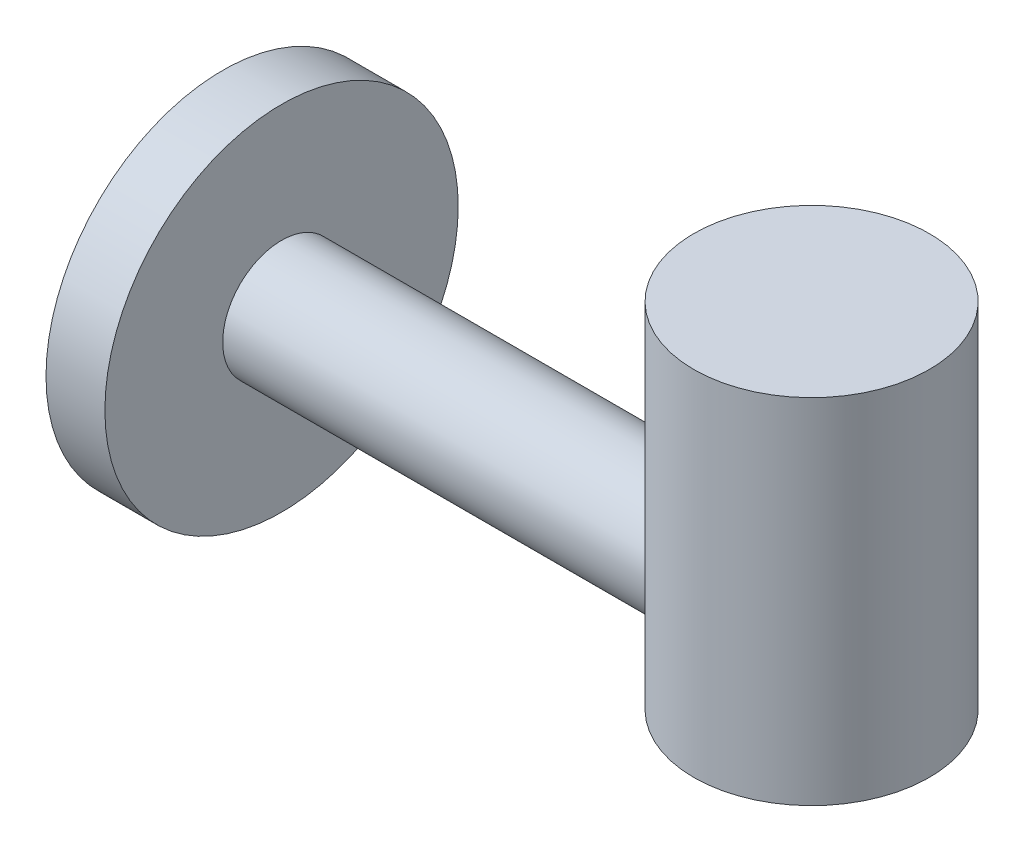
ISO-10303-21;
HEADER;
FILE_DESCRIPTION(('STEP AP214'),'2;1');
FILE_NAME('part.step','',(''),(''),'','','');
FILE_SCHEMA(('AUTOMOTIVE_DESIGN { 1 0 10303 214 1 1 1 1 }'));
ENDSEC;
DATA;
#1=APPLICATION_CONTEXT('core data for automotive mechanical design processes');
#2=APPLICATION_PROTOCOL_DEFINITION('international standard','automotive_design',2000,#1);
#3=PRODUCT_CONTEXT('',#1,'mechanical');
#4=PRODUCT('Part','Part','',(#3));
#5=PRODUCT_RELATED_PRODUCT_CATEGORY('part','',(#4));
#6=PRODUCT_DEFINITION_FORMATION('','',#4);
#7=PRODUCT_DEFINITION_CONTEXT('part definition',#1,'design');
#8=PRODUCT_DEFINITION('design','',#6,#7);
#9=PRODUCT_DEFINITION_SHAPE('','',#8);
#10=(LENGTH_UNIT() NAMED_UNIT(*) SI_UNIT(.MILLI.,.METRE.));
#11=(NAMED_UNIT(*) PLANE_ANGLE_UNIT() SI_UNIT($,.RADIAN.));
#12=(NAMED_UNIT(*) SI_UNIT($,.STERADIAN.) SOLID_ANGLE_UNIT());
#13=UNCERTAINTY_MEASURE_WITH_UNIT(LENGTH_MEASURE(1.E-05),#10,'distance_accuracy_value','');
#14=(GEOMETRIC_REPRESENTATION_CONTEXT(3) GLOBAL_UNCERTAINTY_ASSIGNED_CONTEXT((#13)) GLOBAL_UNIT_ASSIGNED_CONTEXT((#10,
#11,#12)) REPRESENTATION_CONTEXT('',''));
#15=CARTESIAN_POINT('',(0.,0.,0.));
#16=DIRECTION('',(0.,0.,1.));
#17=DIRECTION('',(1.,0.,0.));
#18=AXIS2_PLACEMENT_3D('',#15,#16,#17);
#19=CARTESIAN_POINT('',(0.,30.,0.));
#20=DIRECTION('',(0.,-1.,0.));
#21=DIRECTION('',(0.,0.,-1.));
#22=AXIS2_PLACEMENT_3D('',#19,#20,#21);
#23=CYLINDRICAL_SURFACE('',#22,10.);
#24=CARTESIAN_POINT('',(-8.66025403784439,7.,-5.));
#25=CARTESIAN_POINT('',(-8.66025482828519,7.13033165679605,-4.99999937774203));
#26=CARTESIAN_POINT('',(-8.66320639320551,7.26067490834689,-4.99489703999514));
#27=CARTESIAN_POINT('',(-8.67490215579888,7.52035521825282,-4.97455590140419));
#28=CARTESIAN_POINT('',(-8.68364905023327,7.64969177979969,-4.95931238151411));
#29=CARTESIAN_POINT('',(-8.70662912382781,7.9065135375637,-4.91885673177676));
#30=CARTESIAN_POINT('',(-8.72087090589727,8.03399550378498,-4.89362896878987));
#31=CARTESIAN_POINT('',(-8.75432466229381,8.28601746448832,-4.83352579766962));
#32=CARTESIAN_POINT('',(-8.77353879767271,8.41055615403501,-4.79864619425836));
#33=CARTESIAN_POINT('',(-8.83745677232208,8.77711120753413,-4.6805346614708));
#34=CARTESIAN_POINT('',(-8.88859880977519,9.01373232073358,-4.58356144574886));
#35=CARTESIAN_POINT('',(-9.00213659941723,9.46716195478893,-4.35632594214356));
#36=CARTESIAN_POINT('',(-9.06453296036385,9.68396940294747,-4.22606185336435));
#37=CARTESIAN_POINT('',(-9.19984032823,10.1115106177475,-3.92334549410417));
#38=CARTESIAN_POINT('',(-9.27319410334728,10.3202685823228,-3.74829976483492));
#39=CARTESIAN_POINT('',(-9.41860822234891,10.7070690515488,-3.36622943427774));
#40=CARTESIAN_POINT('',(-9.49066790509843,10.8850962349664,-3.15918897852743));
#41=CARTESIAN_POINT('',(-9.59484443095073,11.1312264286858,-2.82033206345807));
#42=CARTESIAN_POINT('',(-9.62993554487431,11.2119131521005,-2.69838192133586));
#43=CARTESIAN_POINT('',(-9.69680156689125,11.3626286654218,-2.44722131237053));
#44=CARTESIAN_POINT('',(-9.72857779329811,11.4326616973628,-2.31801376345375));
#45=CARTESIAN_POINT('',(-9.78789520431625,11.5613762312932,-2.05317391777883));
#46=CARTESIAN_POINT('',(-9.81543747951442,11.6200606574798,-1.91754328730047));
#47=CARTESIAN_POINT('',(-9.86547242365067,11.7254310158281,-1.64079696990286));
#48=CARTESIAN_POINT('',(-9.88796562891049,11.7721182224333,-1.49968186742444));
#49=CARTESIAN_POINT('',(-9.92580359946711,11.8500155125182,-1.22330436599559));
#50=CARTESIAN_POINT('',(-9.94154295735176,11.8820901096035,-1.08833937324155));
#51=CARTESIAN_POINT('',(-9.96761571585522,11.9349664286038,-0.81570918880021));
#52=CARTESIAN_POINT('',(-9.97794964280152,11.9557692480603,-0.678044261360655));
#53=CARTESIAN_POINT('',(-9.99290900237256,11.9858199114167,-0.401217055741357));
#54=CARTESIAN_POINT('',(-9.99753719051025,11.9950733329762,-0.262055533104009));
#55=CARTESIAN_POINT('',(-10.0009568128334,12.0019143333983,0.0166220416280713));
#56=CARTESIAN_POINT('',(-9.99974860411976,11.9995026259935,0.156138071510185));
#57=CARTESIAN_POINT('',(-9.99189263105534,11.9837693970487,0.422158287145518));
#58=CARTESIAN_POINT('',(-9.9857287219252,11.9714182292176,0.548735568605438));
#59=CARTESIAN_POINT('',(-9.9687211507105,11.937167427645,0.800312348574872));
#60=CARTESIAN_POINT('',(-9.95787601100424,11.915264778974,0.925311336065689));
#61=CARTESIAN_POINT('',(-9.93176736436012,11.8621537757626,1.17280363036129));
#62=CARTESIAN_POINT('',(-9.91650533549045,11.8309485341379,1.29529776073403));
#63=CARTESIAN_POINT('',(-9.88192155120269,11.7595523484822,1.53706747687734));
#64=CARTESIAN_POINT('',(-9.86259824100145,11.7193579627522,1.6563418102202));
#65=CARTESIAN_POINT('',(-9.79859222392452,11.5846254604358,2.01140340124728));
#66=CARTESIAN_POINT('',(-9.74822622058318,11.4766310411066,2.24122720645224));
#67=CARTESIAN_POINT('',(-9.63687815372567,11.2286703075067,2.67992393299637));
#68=CARTESIAN_POINT('',(-9.57589229137331,11.088692546844,2.88878931500038));
#69=CARTESIAN_POINT('',(-9.44222356886893,10.7655365262267,3.30085071454948));
#70=CARTESIAN_POINT('',(-9.36897995679247,10.5795253968794,3.50164452019891));
#71=CARTESIAN_POINT('',(-9.22270586177088,10.1770108060787,3.87054772569916));
#72=CARTESIAN_POINT('',(-9.14967558498933,9.96048410309175,4.03863197852248));
#73=CARTESIAN_POINT('',(-9.04390911775424,9.60880646271854,4.2679539578839));
#74=CARTESIAN_POINT('',(-9.00829977481543,9.48294906884979,4.34240098162072));
#75=CARTESIAN_POINT('',(-8.94051483957135,9.22448612172961,4.48030007564995));
#76=CARTESIAN_POINT('',(-8.90833780331999,9.09188344112137,4.54375677655288));
#77=CARTESIAN_POINT('',(-8.84860631442917,8.82079650964539,4.65901104656178));
#78=CARTESIAN_POINT('',(-8.82104906525582,8.68231588101922,4.71081567564999));
#79=CARTESIAN_POINT('',(-8.7716484423619,8.40037865394852,4.80217514780264));
#80=CARTESIAN_POINT('',(-8.74980428958555,8.25692273697478,4.84173166119403));
#81=CARTESIAN_POINT('',(-8.71426171459812,7.97774306492491,4.90539138118897));
#82=CARTESIAN_POINT('',(-8.7000553284825,7.84230626644245,4.93047005719824));
#83=CARTESIAN_POINT('',(-8.67788216659553,7.5693280921951,4.96939299432912));
#84=CARTESIAN_POINT('',(-8.66991462570621,7.43178697660888,4.98323863305272));
#85=CARTESIAN_POINT('',(-8.66056020235633,7.15588450754079,4.99947854378905));
#86=CARTESIAN_POINT('',(-8.65916956150024,7.01752366777004,5.00187935599941));
#87=CARTESIAN_POINT('',(-8.66301922537735,6.74117909506749,4.99520900229025));
#88=CARTESIAN_POINT('',(-8.66825908252539,6.60319533731123,4.98613861072294));
#89=CARTESIAN_POINT('',(-8.68421505193302,6.34391192060064,4.95828928039379));
#90=CARTESIAN_POINT('',(-8.69426699139328,6.22244328566533,4.94068517767344));
#91=CARTESIAN_POINT('',(-8.71910498639122,5.98158242408372,4.89671673345791));
#92=CARTESIAN_POINT('',(-8.7338925000332,5.86219084892649,4.87034969372092));
#93=CARTESIAN_POINT('',(-8.78469607426189,5.50828995855714,4.77850297980869));
#94=CARTESIAN_POINT('',(-8.82716454630259,5.27788570816812,4.7002591459757));
#95=CARTESIAN_POINT('',(-8.92681241600885,4.82290676431733,4.50823244687956));
#96=CARTESIAN_POINT('',(-8.98458205429472,4.59909630804791,4.392971424463));
#97=CARTESIAN_POINT('',(-9.10780608277643,4.17266225441961,4.1314342135104));
#98=CARTESIAN_POINT('',(-9.1732644129012,3.97004962092247,3.9851420924436));
#99=CARTESIAN_POINT('',(-9.31439795768908,3.56510859636239,3.64419701683803));
#100=CARTESIAN_POINT('',(-9.39032093861059,3.36603551612006,3.44577250062108));
#101=CARTESIAN_POINT('',(-9.53671997076951,3.00291753315272,3.01697632238968));
#102=CARTESIAN_POINT('',(-9.60719417697592,2.83888446260488,2.78659391213232));
#103=CARTESIAN_POINT('',(-9.70419418614479,2.62099052622877,2.41774074756936));
#104=CARTESIAN_POINT('',(-9.73542921288423,2.55233790017969,2.28903769990884));
#105=CARTESIAN_POINT('',(-9.79367711332059,2.42624348134595,2.02535752273871));
#106=CARTESIAN_POINT('',(-9.82069185600805,2.36879672312383,1.89038320507347));
#107=CARTESIAN_POINT('',(-9.86968940022035,2.26578209154344,1.61516754079524));
#108=CARTESIAN_POINT('',(-9.89167460130352,2.2202085521106,1.47492874316051));
#109=CARTESIAN_POINT('',(-9.92995088678441,2.14149092398245,1.19024723850078));
#110=CARTESIAN_POINT('',(-9.94624264638291,2.10834536138541,1.04580503217188));
#111=CARTESIAN_POINT('',(-9.97139931839171,2.05740496637586,0.767401441682124));
#112=CARTESIAN_POINT('',(-9.98080865626407,2.03848039735717,0.633694933854979));
#113=CARTESIAN_POINT('',(-9.99424478074505,2.01150654681825,0.364924207537125));
#114=CARTESIAN_POINT('',(-9.9982719832244,2.00345642504287,0.229860094759433));
#115=CARTESIAN_POINT('',(-10.0008314531461,1.99833682281879,-0.0404881253987298));
#116=CARTESIAN_POINT('',(-9.99936531979799,2.00126414663715,-0.175772157294895));
#117=CARTESIAN_POINT('',(-9.99098333266103,2.01805254775259,-0.445485239489124));
#118=CARTESIAN_POINT('',(-9.98406762889855,2.03191332405238,-0.579914313221435));
#119=CARTESIAN_POINT('',(-9.96560870935097,2.06911767941731,-0.838004211928029));
#120=CARTESIAN_POINT('',(-9.95440210269674,2.09177283422684,-0.961788818118175));
#121=CARTESIAN_POINT('',(-9.92767317989821,2.14621315553766,-1.20687032491423));
#122=CARTESIAN_POINT('',(-9.91214948953036,2.17800122935662,-1.32816642014825));
#123=CARTESIAN_POINT('',(-9.85961295376399,2.28660824427135,-1.68709586409475));
#124=CARTESIAN_POINT('',(-9.81661817605329,2.37670192508612,-1.91998814282436));
#125=CARTESIAN_POINT('',(-9.71629432734438,2.59364222171954,-2.37715486497024));
#126=CARTESIAN_POINT('',(-9.65843082383811,2.72189596544926,-2.60063468941493));
#127=CARTESIAN_POINT('',(-9.53440669320975,3.00979030518456,-3.02386422902506));
#128=CARTESIAN_POINT('',(-9.46824226032902,3.16944531703203,-3.22360297720279));
#129=CARTESIAN_POINT('',(-9.32643278468726,3.53397517110684,-3.61456788757425));
#130=CARTESIAN_POINT('',(-9.25049954016331,3.74176903354589,-3.80296860888284));
#131=CARTESIAN_POINT('',(-9.1031442101187,4.1872970477145,-4.14333626823683));
#132=CARTESIAN_POINT('',(-9.03172615645363,4.42505740656781,-4.29527097306547));
#133=CARTESIAN_POINT('',(-8.93341291054547,4.80421966671763,-4.49442606762734));
#134=CARTESIAN_POINT('',(-8.90168698468314,4.93662632820895,-4.55675683233958));
#135=CARTESIAN_POINT('',(-8.8428797220414,5.20725546376689,-4.66985426801939));
#136=CARTESIAN_POINT('',(-8.81579599491154,5.34547489879388,-4.72062689492349));
#137=CARTESIAN_POINT('',(-8.76742025858706,5.62640787429263,-4.80987708806143));
#138=CARTESIAN_POINT('',(-8.74611337114852,5.76910879308549,-4.8483862843261));
#139=CARTESIAN_POINT('',(-8.71014784774038,6.05809214447055,-4.91270711070743));
#140=CARTESIAN_POINT('',(-8.69548456411172,6.20437199760948,-4.93852761851022));
#141=CARTESIAN_POINT('',(-8.67647541111358,6.45899788692934,-4.97182308032503));
#142=CARTESIAN_POINT('',(-8.67040719452513,6.56682421622676,-4.98237929832923));
#143=CARTESIAN_POINT('',(-8.66229604436744,6.78309765998214,-4.99646825199979));
#144=CARTESIAN_POINT('',(-8.66025338008092,6.89154481548263,-5.00000051781052));
#145=CARTESIAN_POINT('',(-8.66025403784439,7.,-5.));
#146=B_SPLINE_CURVE_WITH_KNOTS('',3,(#24,#25,#26,#27,#28,#29,#30,#31,#32,#33,#34,#35,#36,#37,
#38,#39,#40,#41,#42,#43,#44,#45,#46,#47,#48,#49,#50,#51,#52,#53,#54,#55,#56,#57,#58,#59,#60,#61,
#62,#63,#64,#65,#66,#67,#68,#69,#70,#71,#72,#73,#74,#75,#76,#77,#78,#79,#80,#81,#82,#83,#84,#85,
#86,#87,#88,#89,#90,#91,#92,#93,#94,#95,#96,#97,#98,#99,#100,#101,#102,#103,#104,#105,#106,#107,
#108,#109,#110,#111,#112,#113,#114,#115,#116,#117,#118,#119,#120,#121,#122,#123,#124,#125,#126,
#127,#128,#129,#130,#131,#132,#133,#134,#135,#136,#137,#138,#139,#140,#141,#142,#143,#144,#145),
.UNSPECIFIED.,.T.,.F.,(4,2,2,2,2,2,2,2,2,2,2,2,2,2,2,2,2,2,2,2,2,2,2,2,2,2,2,2,2,2,2,2,2,2,2,2,
2,2,2,2,2,2,2,2,2,2,2,2,2,2,2,2,2,2,2,2,2,2,2,2,4),(0.,0.390882384556487,0.781946787673774,
1.17362595011564,1.56547562833135,2.34415414386117,3.12287479153474,3.96582272680017,
4.80918971852755,5.25982992442626,5.71029022430252,6.16063429887937,6.61093051439736,
7.02920538093652,7.44743951241416,7.8654715838904,8.28347807833438,8.66500933177614,
9.0466611030143,9.42818530565609,9.80985583438832,10.5829669450729,11.3563551760292,
12.2028497813491,13.0499926207968,13.501002097322,13.9518210829089,14.4023661773263,
14.8528498019288,15.2676702585959,15.6824398346428,16.0969723603126,16.5114769048702,
16.8804871114428,17.2496110473149,17.9873544979167,18.759266696418,19.5315761871159,
20.4012390551442,21.2711951250237,21.7182117808489,22.1650299066984,22.6116344121698,
23.0581859356052,23.4637505264203,23.8692837779652,24.2746989806128,24.6801030225936,
25.0586722294313,25.4373620814588,26.1940875134848,26.9831783738577,27.7726323429201,
28.6406529303875,29.5094379801419,29.9581473751206,30.4066250230036,30.8539364017616,
31.3009343703532,31.6261844795329,31.9514563450476),.UNSPECIFIED.);
#147=CARTESIAN_POINT('',(-8.66025403784439,7.,-5.));
#148=VERTEX_POINT('',#147);
#149=EDGE_CURVE('E43',#148,#148,#146,.T.);
#150=ORIENTED_EDGE('',*,*,#149,.T.);
#151=EDGE_LOOP('',(#150));
#152=FACE_BOUND('',#151,.T.);
#153=CARTESIAN_POINT('',(0.,30.,0.));
#154=DIRECTION('',(0.,1.,0.));
#155=DIRECTION('',(0.,0.,1.));
#156=AXIS2_PLACEMENT_3D('',#153,#154,#155);
#157=CIRCLE('',#156,10.);
#158=CARTESIAN_POINT('',(0.,30.,10.));
#159=VERTEX_POINT('',#158);
#160=EDGE_CURVE('E10',#159,#159,#157,.T.);
#161=ORIENTED_EDGE('',*,*,#160,.F.);
#162=EDGE_LOOP('',(#161));
#163=FACE_BOUND('',#162,.T.);
#164=CARTESIAN_POINT('',(0.,0.,0.));
#165=DIRECTION('',(0.,1.,0.));
#166=DIRECTION('',(0.,0.,1.));
#167=AXIS2_PLACEMENT_3D('',#164,#165,#166);
#168=CIRCLE('',#167,10.);
#169=CARTESIAN_POINT('',(0.,0.,10.));
#170=VERTEX_POINT('',#169);
#171=EDGE_CURVE('E51',#170,#170,#168,.T.);
#172=ORIENTED_EDGE('',*,*,#171,.T.);
#173=EDGE_LOOP('',(#172));
#174=FACE_BOUND('',#173,.T.);
#175=ADVANCED_FACE('F39',(#152,#163,#174),#23,.T.);
#176=CARTESIAN_POINT('',(0.,30.,0.));
#177=DIRECTION('',(0.,1.,0.));
#178=DIRECTION('',(0.,0.,1.));
#179=AXIS2_PLACEMENT_3D('',#176,#177,#178);
#180=PLANE('',#179);
#181=ORIENTED_EDGE('',*,*,#160,.T.);
#182=EDGE_LOOP('',(#181));
#183=FACE_BOUND('',#182,.T.);
#184=ADVANCED_FACE('F86',(#183),#180,.T.);
#185=CARTESIAN_POINT('',(0.,0.,0.));
#186=DIRECTION('',(0.,1.,0.));
#187=DIRECTION('',(0.,0.,1.));
#188=AXIS2_PLACEMENT_3D('',#185,#186,#187);
#189=PLANE('',#188);
#190=ORIENTED_EDGE('',*,*,#171,.F.);
#191=EDGE_LOOP('',(#190));
#192=FACE_BOUND('',#191,.T.);
#193=ADVANCED_FACE('F93',(#192),#189,.F.);
#194=CARTESIAN_POINT('',(-45.,7.,0.));
#195=DIRECTION('',(1.,0.,0.));
#196=DIRECTION('',(0.,0.,-1.));
#197=AXIS2_PLACEMENT_3D('',#194,#195,#196);
#198=CYLINDRICAL_SURFACE('',#197,5.);
#199=CARTESIAN_POINT('',(-45.,7.,0.));
#200=DIRECTION('',(1.,0.,0.));
#201=DIRECTION('',(0.,0.,-1.));
#202=AXIS2_PLACEMENT_3D('',#199,#200,#201);
#203=CIRCLE('',#202,5.);
#204=CARTESIAN_POINT('',(-45.,7.,-5.));
#205=VERTEX_POINT('',#204);
#206=EDGE_CURVE('E57',#205,#205,#203,.T.);
#207=ORIENTED_EDGE('',*,*,#206,.T.);
#208=EDGE_LOOP('',(#207));
#209=FACE_BOUND('',#208,.T.);
#210=ORIENTED_EDGE('',*,*,#149,.F.);
#211=EDGE_LOOP('',(#210));
#212=FACE_BOUND('',#211,.T.);
#213=ADVANCED_FACE('F72',(#209,#212),#198,.T.);
#214=CARTESIAN_POINT('',(-50.,7.,0.));
#215=DIRECTION('',(1.,0.,0.));
#216=DIRECTION('',(0.,0.,-1.));
#217=AXIS2_PLACEMENT_3D('',#214,#215,#216);
#218=CYLINDRICAL_SURFACE('',#217,15.);
#219=CARTESIAN_POINT('',(-50.,7.,0.));
#220=DIRECTION('',(-1.,0.,0.));
#221=DIRECTION('',(0.,0.,1.));
#222=AXIS2_PLACEMENT_3D('',#219,#220,#221);
#223=CIRCLE('',#222,15.);
#224=CARTESIAN_POINT('',(-50.,7.,15.));
#225=VERTEX_POINT('',#224);
#226=EDGE_CURVE('E60',#225,#225,#223,.T.);
#227=ORIENTED_EDGE('',*,*,#226,.F.);
#228=EDGE_LOOP('',(#227));
#229=FACE_BOUND('',#228,.T.);
#230=CARTESIAN_POINT('',(-45.,7.,0.));
#231=DIRECTION('',(-1.,0.,0.));
#232=DIRECTION('',(0.,0.,1.));
#233=AXIS2_PLACEMENT_3D('',#230,#231,#232);
#234=CIRCLE('',#233,15.);
#235=CARTESIAN_POINT('',(-45.,7.,15.));
#236=VERTEX_POINT('',#235);
#237=EDGE_CURVE('E61',#236,#236,#234,.T.);
#238=ORIENTED_EDGE('',*,*,#237,.T.);
#239=EDGE_LOOP('',(#238));
#240=FACE_BOUND('',#239,.T.);
#241=ADVANCED_FACE('F69',(#229,#240),#218,.T.);
#242=CARTESIAN_POINT('',(-50.,7.,0.));
#243=DIRECTION('',(-1.,0.,0.));
#244=DIRECTION('',(0.,0.,1.));
#245=AXIS2_PLACEMENT_3D('',#242,#243,#244);
#246=PLANE('',#245);
#247=ORIENTED_EDGE('',*,*,#226,.T.);
#248=EDGE_LOOP('',(#247));
#249=FACE_BOUND('',#248,.T.);
#250=ADVANCED_FACE('F67',(#249),#246,.T.);
#251=CARTESIAN_POINT('',(-45.,7.,0.));
#252=DIRECTION('',(-1.,0.,0.));
#253=DIRECTION('',(0.,0.,1.));
#254=AXIS2_PLACEMENT_3D('',#251,#252,#253);
#255=PLANE('',#254);
#256=ORIENTED_EDGE('',*,*,#206,.F.);
#257=EDGE_LOOP('',(#256));
#258=FACE_BOUND('',#257,.T.);
#259=ORIENTED_EDGE('',*,*,#237,.F.);
#260=EDGE_LOOP('',(#259));
#261=FACE_BOUND('',#260,.T.);
#262=ADVANCED_FACE('F76',(#258,#261),#255,.F.);
#263=CLOSED_SHELL('',(#175,#184,#193,#213,#241,#250,#262));
#264=MANIFOLD_SOLID_BREP('B2',#263);
#265=ADVANCED_BREP_SHAPE_REPRESENTATION('',(#18,#264),#14);
#266=SHAPE_DEFINITION_REPRESENTATION(#9,#265);
ENDSEC;
END-ISO-10303-21;
